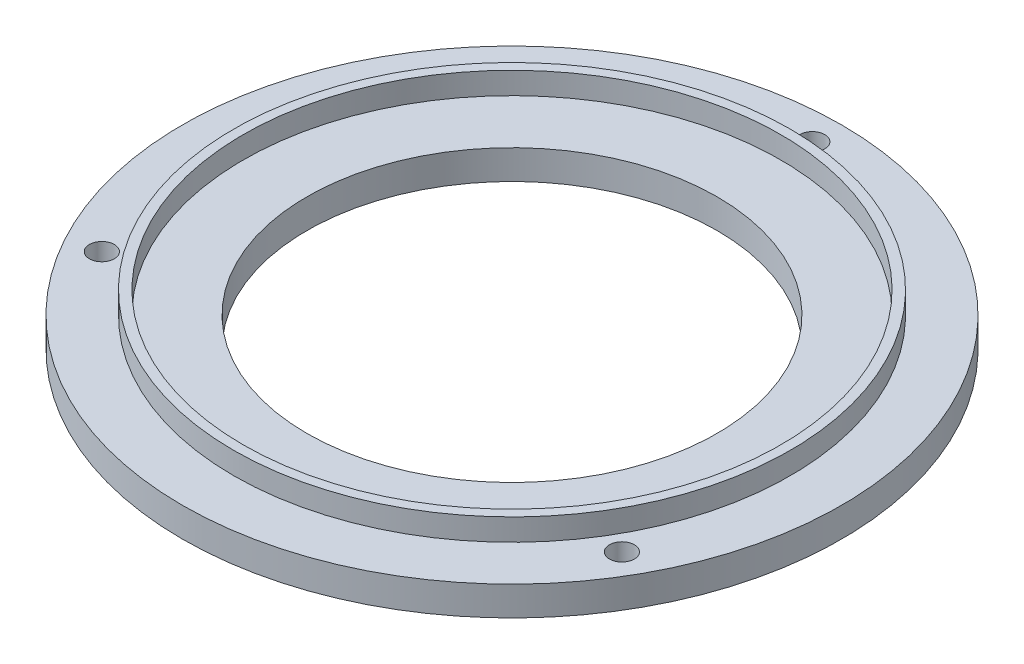
ISO-10303-21;
HEADER;
FILE_DESCRIPTION(('STEP AP214'),'2;1');
FILE_NAME('part.step','',(''),(''),'','','');
FILE_SCHEMA(('AUTOMOTIVE_DESIGN { 1 0 10303 214 1 1 1 1 }'));
ENDSEC;
DATA;
#1=APPLICATION_CONTEXT('core data for automotive mechanical design processes');
#2=APPLICATION_PROTOCOL_DEFINITION('international standard','automotive_design',2000,#1);
#3=PRODUCT_CONTEXT('',#1,'mechanical');
#4=PRODUCT('Part','Part','',(#3));
#5=PRODUCT_RELATED_PRODUCT_CATEGORY('part','',(#4));
#6=PRODUCT_DEFINITION_FORMATION('','',#4);
#7=PRODUCT_DEFINITION_CONTEXT('part definition',#1,'design');
#8=PRODUCT_DEFINITION('design','',#6,#7);
#9=PRODUCT_DEFINITION_SHAPE('','',#8);
#10=(LENGTH_UNIT() NAMED_UNIT(*) SI_UNIT(.MILLI.,.METRE.));
#11=(NAMED_UNIT(*) PLANE_ANGLE_UNIT() SI_UNIT($,.RADIAN.));
#12=(NAMED_UNIT(*) SI_UNIT($,.STERADIAN.) SOLID_ANGLE_UNIT());
#13=UNCERTAINTY_MEASURE_WITH_UNIT(LENGTH_MEASURE(1.E-05),#10,'distance_accuracy_value','');
#14=(GEOMETRIC_REPRESENTATION_CONTEXT(3) GLOBAL_UNCERTAINTY_ASSIGNED_CONTEXT((#13)) GLOBAL_UNIT_ASSIGNED_CONTEXT((#10,
#11,#12)) REPRESENTATION_CONTEXT('',''));
#15=CARTESIAN_POINT('',(0.,0.,0.));
#16=DIRECTION('',(0.,0.,1.));
#17=DIRECTION('',(1.,0.,0.));
#18=AXIS2_PLACEMENT_3D('',#15,#16,#17);
#19=CARTESIAN_POINT('',(0.,4.,0.));
#20=DIRECTION('',(0.,1.,0.));
#21=DIRECTION('',(0.,0.,1.));
#22=AXIS2_PLACEMENT_3D('',#19,#20,#21);
#23=PLANE('',#22);
#24=CARTESIAN_POINT('',(0.,4.,0.));
#25=DIRECTION('',(0.,1.,0.));
#26=DIRECTION('',(0.,0.,1.));
#27=AXIS2_PLACEMENT_3D('',#24,#25,#26);
#28=CIRCLE('',#27,28.);
#29=CARTESIAN_POINT('',(0.,4.,28.));
#30=VERTEX_POINT('',#29);
#31=EDGE_CURVE('E52',#30,#30,#28,.T.);
#32=ORIENTED_EDGE('',*,*,#31,.F.);
#33=EDGE_LOOP('',(#32));
#34=FACE_BOUND('',#33,.T.);
#35=CARTESIAN_POINT('',(0.,4.,0.));
#36=DIRECTION('',(0.,1.,0.));
#37=DIRECTION('',(0.,0.,1.));
#38=AXIS2_PLACEMENT_3D('',#35,#36,#37);
#39=CIRCLE('',#38,36.7);
#40=CARTESIAN_POINT('',(0.,4.,36.7));
#41=VERTEX_POINT('',#40);
#42=EDGE_CURVE('E63',#41,#41,#39,.T.);
#43=ORIENTED_EDGE('',*,*,#42,.T.);
#44=EDGE_LOOP('',(#43));
#45=FACE_BOUND('',#44,.T.);
#46=ADVANCED_FACE('F38',(#34,#45),#23,.T.);
#47=CARTESIAN_POINT('',(0.,4.,-41.));
#48=DIRECTION('',(0.,1.,0.));
#49=DIRECTION('',(0.,0.,1.));
#50=AXIS2_PLACEMENT_3D('',#47,#48,#49);
#51=CIRCLE('',#50,1.7);
#52=CARTESIAN_POINT('',(0.,4.,-39.3));
#53=VERTEX_POINT('',#52);
#54=EDGE_CURVE('E88',#53,#53,#51,.T.);
#55=ORIENTED_EDGE('',*,*,#54,.F.);
#56=EDGE_LOOP('',(#55));
#57=FACE_BOUND('',#56,.T.);
#58=CARTESIAN_POINT('',(35.5070415551646,4.,20.4999999999985));
#59=DIRECTION('',(0.,1.,0.));
#60=DIRECTION('',(0.,0.,1.));
#61=AXIS2_PLACEMENT_3D('',#58,#59,#60);
#62=CIRCLE('',#61,1.7);
#63=CARTESIAN_POINT('',(35.5070415551646,4.,22.1999999999985));
#64=VERTEX_POINT('',#63);
#65=EDGE_CURVE('E78',#64,#64,#62,.T.);
#66=ORIENTED_EDGE('',*,*,#65,.F.);
#67=EDGE_LOOP('',(#66));
#68=FACE_BOUND('',#67,.T.);
#69=CARTESIAN_POINT('',(-35.5070415551594,4.,20.5000000000015));
#70=DIRECTION('',(0.,1.,0.));
#71=DIRECTION('',(0.,0.,1.));
#72=AXIS2_PLACEMENT_3D('',#69,#70,#71);
#73=CIRCLE('',#72,1.7);
#74=CARTESIAN_POINT('',(-35.5070415551594,4.,22.2000000000015));
#75=VERTEX_POINT('',#74);
#76=EDGE_CURVE('E74',#75,#75,#73,.T.);
#77=ORIENTED_EDGE('',*,*,#76,.F.);
#78=EDGE_LOOP('',(#77));
#79=FACE_BOUND('',#78,.T.);
#80=CARTESIAN_POINT('',(0.,4.,0.));
#81=DIRECTION('',(0.,1.,0.));
#82=DIRECTION('',(0.,0.,1.));
#83=AXIS2_PLACEMENT_3D('',#80,#81,#82);
#84=CIRCLE('',#83,38.);
#85=CARTESIAN_POINT('',(0.,4.,38.));
#86=VERTEX_POINT('',#85);
#87=EDGE_CURVE('E10',#86,#86,#84,.T.);
#88=ORIENTED_EDGE('',*,*,#87,.F.);
#89=EDGE_LOOP('',(#88));
#90=FACE_BOUND('',#89,.T.);
#91=CARTESIAN_POINT('',(0.,4.,0.));
#92=DIRECTION('',(0.,1.,0.));
#93=DIRECTION('',(0.,0.,1.));
#94=AXIS2_PLACEMENT_3D('',#91,#92,#93);
#95=CIRCLE('',#94,45.);
#96=CARTESIAN_POINT('',(0.,4.,45.));
#97=VERTEX_POINT('',#96);
#98=EDGE_CURVE('E42',#97,#97,#95,.T.);
#99=ORIENTED_EDGE('',*,*,#98,.T.);
#100=EDGE_LOOP('',(#99));
#101=FACE_BOUND('',#100,.T.);
#102=ADVANCED_FACE('F95',(#57,#68,#79,#90,#101),#23,.T.);
#103=CARTESIAN_POINT('',(0.,0.,0.));
#104=DIRECTION('',(0.,1.,0.));
#105=DIRECTION('',(0.,0.,1.));
#106=AXIS2_PLACEMENT_3D('',#103,#104,#105);
#107=PLANE('',#106);
#108=CARTESIAN_POINT('',(0.,0.,-41.));
#109=DIRECTION('',(0.,1.,0.));
#110=DIRECTION('',(0.,0.,1.));
#111=AXIS2_PLACEMENT_3D('',#108,#109,#110);
#112=CIRCLE('',#111,1.7);
#113=CARTESIAN_POINT('',(0.,0.,-39.3));
#114=VERTEX_POINT('',#113);
#115=EDGE_CURVE('E84',#114,#114,#112,.T.);
#116=ORIENTED_EDGE('',*,*,#115,.T.);
#117=EDGE_LOOP('',(#116));
#118=FACE_BOUND('',#117,.T.);
#119=CARTESIAN_POINT('',(35.5070415551646,0.,20.4999999999985));
#120=DIRECTION('',(0.,1.,0.));
#121=DIRECTION('',(0.,0.,1.));
#122=AXIS2_PLACEMENT_3D('',#119,#120,#121);
#123=CIRCLE('',#122,1.7);
#124=CARTESIAN_POINT('',(35.5070415551646,0.,22.1999999999985));
#125=VERTEX_POINT('',#124);
#126=EDGE_CURVE('E80',#125,#125,#123,.T.);
#127=ORIENTED_EDGE('',*,*,#126,.T.);
#128=EDGE_LOOP('',(#127));
#129=FACE_BOUND('',#128,.T.);
#130=CARTESIAN_POINT('',(-35.5070415551594,0.,20.5000000000015));
#131=DIRECTION('',(0.,1.,0.));
#132=DIRECTION('',(0.,0.,1.));
#133=AXIS2_PLACEMENT_3D('',#130,#131,#132);
#134=CIRCLE('',#133,1.7);
#135=CARTESIAN_POINT('',(-35.5070415551594,0.,22.2000000000015));
#136=VERTEX_POINT('',#135);
#137=EDGE_CURVE('E68',#136,#136,#134,.T.);
#138=ORIENTED_EDGE('',*,*,#137,.T.);
#139=EDGE_LOOP('',(#138));
#140=FACE_BOUND('',#139,.T.);
#141=CARTESIAN_POINT('',(0.,0.,0.));
#142=DIRECTION('',(0.,1.,0.));
#143=DIRECTION('',(0.,0.,1.));
#144=AXIS2_PLACEMENT_3D('',#141,#142,#143);
#145=CIRCLE('',#144,45.);
#146=CARTESIAN_POINT('',(0.,0.,45.));
#147=VERTEX_POINT('',#146);
#148=EDGE_CURVE('E37',#147,#147,#145,.T.);
#149=ORIENTED_EDGE('',*,*,#148,.F.);
#150=EDGE_LOOP('',(#149));
#151=FACE_BOUND('',#150,.T.);
#152=CARTESIAN_POINT('',(0.,0.,0.));
#153=DIRECTION('',(0.,1.,0.));
#154=DIRECTION('',(0.,0.,1.));
#155=AXIS2_PLACEMENT_3D('',#152,#153,#154);
#156=CIRCLE('',#155,28.);
#157=CARTESIAN_POINT('',(0.,0.,28.));
#158=VERTEX_POINT('',#157);
#159=EDGE_CURVE('E57',#158,#158,#156,.T.);
#160=ORIENTED_EDGE('',*,*,#159,.T.);
#161=EDGE_LOOP('',(#160));
#162=FACE_BOUND('',#161,.T.);
#163=ADVANCED_FACE('F92',(#118,#129,#140,#151,#162),#107,.F.);
#164=CARTESIAN_POINT('',(0.,4.,0.));
#165=DIRECTION('',(0.,-1.,0.));
#166=DIRECTION('',(0.,0.,-1.));
#167=AXIS2_PLACEMENT_3D('',#164,#165,#166);
#168=CYLINDRICAL_SURFACE('',#167,45.);
#169=ORIENTED_EDGE('',*,*,#98,.F.);
#170=EDGE_LOOP('',(#169));
#171=FACE_BOUND('',#170,.T.);
#172=ORIENTED_EDGE('',*,*,#148,.T.);
#173=EDGE_LOOP('',(#172));
#174=FACE_BOUND('',#173,.T.);
#175=ADVANCED_FACE('F36',(#171,#174),#168,.T.);
#176=CARTESIAN_POINT('',(0.,4.,0.));
#177=DIRECTION('',(0.,-1.,0.));
#178=DIRECTION('',(0.,0.,-1.));
#179=AXIS2_PLACEMENT_3D('',#176,#177,#178);
#180=CYLINDRICAL_SURFACE('',#179,28.);
#181=ORIENTED_EDGE('',*,*,#31,.T.);
#182=EDGE_LOOP('',(#181));
#183=FACE_BOUND('',#182,.T.);
#184=ORIENTED_EDGE('',*,*,#159,.F.);
#185=EDGE_LOOP('',(#184));
#186=FACE_BOUND('',#185,.T.);
#187=ADVANCED_FACE('F106',(#183,#186),#180,.F.);
#188=CARTESIAN_POINT('',(0.,7.,0.));
#189=DIRECTION('',(0.,1.,0.));
#190=DIRECTION('',(0.,0.,1.));
#191=AXIS2_PLACEMENT_3D('',#188,#189,#190);
#192=PLANE('',#191);
#193=CARTESIAN_POINT('',(0.,7.,0.));
#194=DIRECTION('',(0.,1.,0.));
#195=DIRECTION('',(0.,0.,1.));
#196=AXIS2_PLACEMENT_3D('',#193,#194,#195);
#197=CIRCLE('',#196,38.);
#198=CARTESIAN_POINT('',(0.,7.,38.));
#199=VERTEX_POINT('',#198);
#200=EDGE_CURVE('E51',#199,#199,#197,.T.);
#201=ORIENTED_EDGE('',*,*,#200,.T.);
#202=EDGE_LOOP('',(#201));
#203=FACE_BOUND('',#202,.T.);
#204=CARTESIAN_POINT('',(0.,7.,0.));
#205=DIRECTION('',(0.,1.,0.));
#206=DIRECTION('',(0.,0.,1.));
#207=AXIS2_PLACEMENT_3D('',#204,#205,#206);
#208=CIRCLE('',#207,36.7);
#209=CARTESIAN_POINT('',(0.,7.,36.7));
#210=VERTEX_POINT('',#209);
#211=EDGE_CURVE('E62',#210,#210,#208,.T.);
#212=ORIENTED_EDGE('',*,*,#211,.F.);
#213=EDGE_LOOP('',(#212));
#214=FACE_BOUND('',#213,.T.);
#215=ADVANCED_FACE('F127',(#203,#214),#192,.T.);
#216=CARTESIAN_POINT('',(0.,7.,0.));
#217=DIRECTION('',(0.,-1.,0.));
#218=DIRECTION('',(0.,0.,-1.));
#219=AXIS2_PLACEMENT_3D('',#216,#217,#218);
#220=CYLINDRICAL_SURFACE('',#219,38.);
#221=ORIENTED_EDGE('',*,*,#200,.F.);
#222=EDGE_LOOP('',(#221));
#223=FACE_BOUND('',#222,.T.);
#224=ORIENTED_EDGE('',*,*,#87,.T.);
#225=EDGE_LOOP('',(#224));
#226=FACE_BOUND('',#225,.T.);
#227=ADVANCED_FACE('F126',(#223,#226),#220,.T.);
#228=CARTESIAN_POINT('',(0.,7.,0.));
#229=DIRECTION('',(0.,-1.,0.));
#230=DIRECTION('',(0.,0.,-1.));
#231=AXIS2_PLACEMENT_3D('',#228,#229,#230);
#232=CYLINDRICAL_SURFACE('',#231,36.7);
#233=ORIENTED_EDGE('',*,*,#211,.T.);
#234=EDGE_LOOP('',(#233));
#235=FACE_BOUND('',#234,.T.);
#236=ORIENTED_EDGE('',*,*,#42,.F.);
#237=EDGE_LOOP('',(#236));
#238=FACE_BOUND('',#237,.T.);
#239=ADVANCED_FACE('F132',(#235,#238),#232,.F.);
#240=CARTESIAN_POINT('',(-35.5070415551594,4.,20.5000000000015));
#241=DIRECTION('',(0.,1.,0.));
#242=DIRECTION('',(0.,0.,1.));
#243=AXIS2_PLACEMENT_3D('',#240,#241,#242);
#244=CYLINDRICAL_SURFACE('',#243,1.7);
#245=ORIENTED_EDGE('',*,*,#137,.F.);
#246=EDGE_LOOP('',(#245));
#247=FACE_BOUND('',#246,.T.);
#248=ORIENTED_EDGE('',*,*,#76,.T.);
#249=EDGE_LOOP('',(#248));
#250=FACE_BOUND('',#249,.T.);
#251=ADVANCED_FACE('F137',(#247,#250),#244,.F.);
#252=CARTESIAN_POINT('',(35.5070415551646,4.,20.4999999999985));
#253=DIRECTION('',(0.,1.,0.));
#254=DIRECTION('',(0.,0.,1.));
#255=AXIS2_PLACEMENT_3D('',#252,#253,#254);
#256=CYLINDRICAL_SURFACE('',#255,1.7);
#257=ORIENTED_EDGE('',*,*,#126,.F.);
#258=EDGE_LOOP('',(#257));
#259=FACE_BOUND('',#258,.T.);
#260=ORIENTED_EDGE('',*,*,#65,.T.);
#261=EDGE_LOOP('',(#260));
#262=FACE_BOUND('',#261,.T.);
#263=ADVANCED_FACE('F139',(#259,#262),#256,.F.);
#264=CARTESIAN_POINT('',(0.,4.,-41.));
#265=DIRECTION('',(0.,1.,0.));
#266=DIRECTION('',(0.,0.,1.));
#267=AXIS2_PLACEMENT_3D('',#264,#265,#266);
#268=CYLINDRICAL_SURFACE('',#267,1.7);
#269=ORIENTED_EDGE('',*,*,#115,.F.);
#270=EDGE_LOOP('',(#269));
#271=FACE_BOUND('',#270,.T.);
#272=ORIENTED_EDGE('',*,*,#54,.T.);
#273=EDGE_LOOP('',(#272));
#274=FACE_BOUND('',#273,.T.);
#275=ADVANCED_FACE('F89',(#271,#274),#268,.F.);
#276=CLOSED_SHELL('',(#46,#102,#163,#175,#187,#215,#227,#239,#251,#263,#275));
#277=MANIFOLD_SOLID_BREP('B2',#276);
#278=ADVANCED_BREP_SHAPE_REPRESENTATION('',(#18,#277),#14);
#279=SHAPE_DEFINITION_REPRESENTATION(#9,#278);
ENDSEC;
END-ISO-10303-21;
